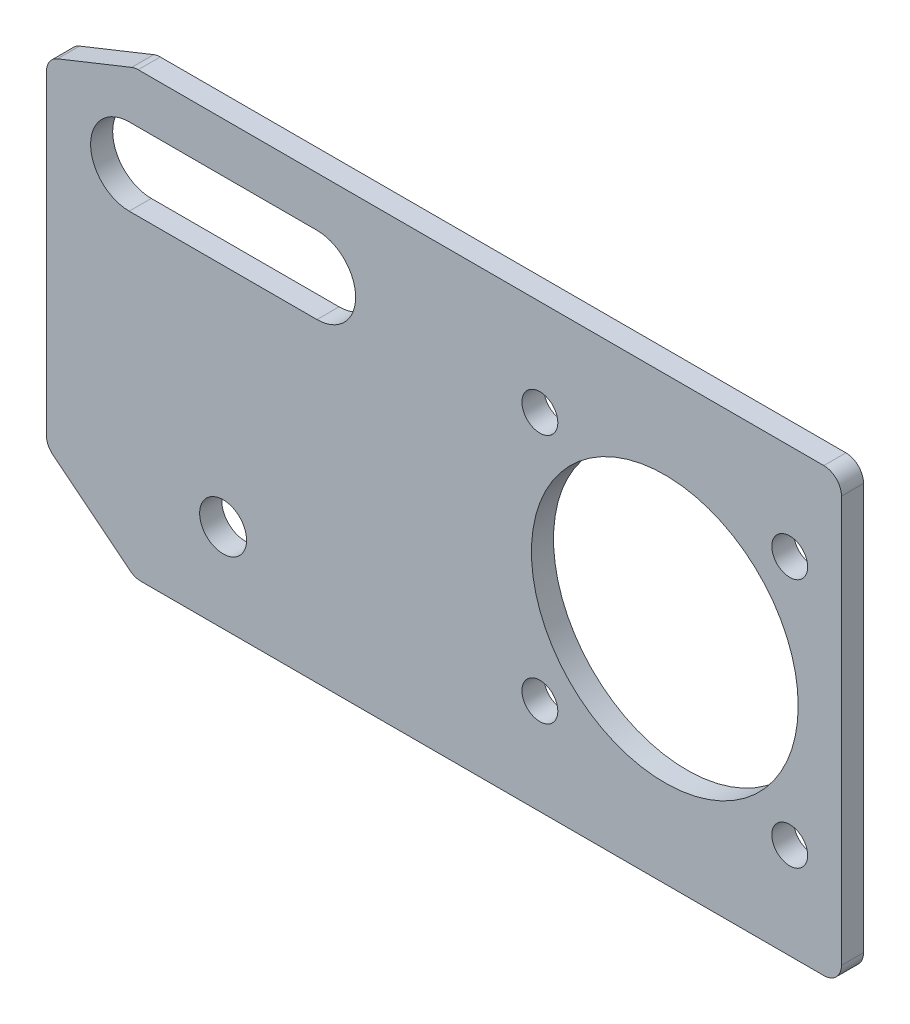
ISO-10303-21;
HEADER;
FILE_DESCRIPTION(('STEP AP214'),'2;1');
FILE_NAME('part.step','',(''),(''),'','','');
FILE_SCHEMA(('AUTOMOTIVE_DESIGN { 1 0 10303 214 1 1 1 1 }'));
ENDSEC;
DATA;
#1=APPLICATION_CONTEXT('core data for automotive mechanical design processes');
#2=APPLICATION_PROTOCOL_DEFINITION('international standard','automotive_design',2000,#1);
#3=PRODUCT_CONTEXT('',#1,'mechanical');
#4=PRODUCT('Part','Part','',(#3));
#5=PRODUCT_RELATED_PRODUCT_CATEGORY('part','',(#4));
#6=PRODUCT_DEFINITION_FORMATION('','',#4);
#7=PRODUCT_DEFINITION_CONTEXT('part definition',#1,'design');
#8=PRODUCT_DEFINITION('design','',#6,#7);
#9=PRODUCT_DEFINITION_SHAPE('','',#8);
#10=(LENGTH_UNIT() NAMED_UNIT(*) SI_UNIT(.MILLI.,.METRE.));
#11=(NAMED_UNIT(*) PLANE_ANGLE_UNIT() SI_UNIT($,.RADIAN.));
#12=(NAMED_UNIT(*) SI_UNIT($,.STERADIAN.) SOLID_ANGLE_UNIT());
#13=UNCERTAINTY_MEASURE_WITH_UNIT(LENGTH_MEASURE(1.E-05),#10,'distance_accuracy_value','');
#14=(GEOMETRIC_REPRESENTATION_CONTEXT(3) GLOBAL_UNCERTAINTY_ASSIGNED_CONTEXT((#13)) GLOBAL_UNIT_ASSIGNED_CONTEXT((#10,
#11,#12)) REPRESENTATION_CONTEXT('',''));
#15=CARTESIAN_POINT('',(0.,0.,0.));
#16=DIRECTION('',(0.,0.,1.));
#17=DIRECTION('',(1.,0.,0.));
#18=AXIS2_PLACEMENT_3D('',#15,#16,#17);
#19=CARTESIAN_POINT('',(-12.7,10.16,3.175));
#20=DIRECTION('',(0.624695047554424,0.78086880944303,0.));
#21=DIRECTION('',(-0.78086880944303,0.624695047554425,0.));
#22=AXIS2_PLACEMENT_3D('',#19,#20,#21);
#23=PLANE('',#22);
#24=DIRECTION('',(0.78086880944303,-0.624695047554425,0.));
#25=VECTOR('',#24,1.);
#26=CARTESIAN_POINT('',(-12.7,10.16,0.));
#27=LINE('',#26,#25);
#28=CARTESIAN_POINT('',(-11.7467254207882,9.39738033663059,0.));
#29=VERTEX_POINT('',#28);
#30=CARTESIAN_POINT('',(-0.695741530018378,0.556593224014704,0.));
#31=VERTEX_POINT('',#30);
#32=EDGE_CURVE('E204',#29,#31,#27,.T.);
#33=ORIENTED_EDGE('',*,*,#32,.T.);
#34=DIRECTION('',(0.,0.,-1.));
#35=VECTOR('',#34,1.);
#36=CARTESIAN_POINT('',(-0.695741530018378,0.556593224014704,3.175));
#37=LINE('',#36,#35);
#38=CARTESIAN_POINT('',(-0.695741530018378,0.556593224014704,3.175));
#39=VERTEX_POINT('',#38);
#40=EDGE_CURVE('E259',#31,#39,#37,.F.);
#41=ORIENTED_EDGE('',*,*,#40,.T.);
#42=DIRECTION('',(0.78086880944303,-0.624695047554425,0.));
#43=VECTOR('',#42,1.);
#44=CARTESIAN_POINT('',(-12.7,10.16,3.175));
#45=LINE('',#44,#43);
#46=CARTESIAN_POINT('',(-11.7467254207882,9.39738033663059,3.175));
#47=VERTEX_POINT('',#46);
#48=EDGE_CURVE('E207',#47,#39,#45,.T.);
#49=ORIENTED_EDGE('',*,*,#48,.F.);
#50=DIRECTION('',(0.,0.,-1.));
#51=VECTOR('',#50,1.);
#52=CARTESIAN_POINT('',(-11.7467254207882,9.39738033663059,3.175));
#53=LINE('',#52,#51);
#54=EDGE_CURVE('E256',#47,#29,#53,.T.);
#55=ORIENTED_EDGE('',*,*,#54,.T.);
#56=EDGE_LOOP('',(#33,#41,#49,#55));
#57=FACE_BOUND('',#56,.T.);
#58=ADVANCED_FACE('F33',(#57),#23,.F.);
#59=CARTESIAN_POINT('',(0.,0.,3.175));
#60=DIRECTION('',(0.,1.,0.));
#61=DIRECTION('',(0.,0.,1.));
#62=AXIS2_PLACEMENT_3D('',#59,#60,#61);
#63=PLANE('',#62);
#64=DIRECTION('',(1.,0.,0.));
#65=VECTOR('',#64,1.);
#66=CARTESIAN_POINT('',(0.,0.,3.175));
#67=LINE('',#66,#65);
#68=CARTESIAN_POINT('',(0.89098389076986,0.,3.175));
#69=VERTEX_POINT('',#68);
#70=CARTESIAN_POINT('',(99.06,0.,3.175));
#71=VERTEX_POINT('',#70);
#72=EDGE_CURVE('E210',#69,#71,#67,.T.);
#73=ORIENTED_EDGE('',*,*,#72,.F.);
#74=DIRECTION('',(0.,0.,-1.));
#75=VECTOR('',#74,1.);
#76=CARTESIAN_POINT('',(0.89098389076986,0.,3.175));
#77=LINE('',#76,#75);
#78=CARTESIAN_POINT('',(0.89098389076986,0.,0.));
#79=VERTEX_POINT('',#78);
#80=EDGE_CURVE('E241',#69,#79,#77,.T.);
#81=ORIENTED_EDGE('',*,*,#80,.T.);
#82=DIRECTION('',(1.,0.,0.));
#83=VECTOR('',#82,1.);
#84=CARTESIAN_POINT('',(0.,0.,0.));
#85=LINE('',#84,#83);
#86=CARTESIAN_POINT('',(99.06,0.,0.));
#87=VERTEX_POINT('',#86);
#88=EDGE_CURVE('E227',#79,#87,#85,.T.);
#89=ORIENTED_EDGE('',*,*,#88,.T.);
#90=DIRECTION('',(0.,0.,-1.));
#91=VECTOR('',#90,1.);
#92=CARTESIAN_POINT('',(99.06,0.,3.175));
#93=LINE('',#92,#91);
#94=EDGE_CURVE('E224',#87,#71,#93,.F.);
#95=ORIENTED_EDGE('',*,*,#94,.T.);
#96=EDGE_LOOP('',(#73,#81,#89,#95));
#97=FACE_BOUND('',#96,.T.);
#98=ADVANCED_FACE('F331',(#97),#63,.F.);
#99=CARTESIAN_POINT('',(101.6,0.,3.175));
#100=DIRECTION('',(-1.,0.,0.));
#101=DIRECTION('',(0.,0.,1.));
#102=AXIS2_PLACEMENT_3D('',#99,#100,#101);
#103=PLANE('',#102);
#104=DIRECTION('',(0.,1.,0.));
#105=VECTOR('',#104,1.);
#106=CARTESIAN_POINT('',(101.6,0.,3.175));
#107=LINE('',#106,#105);
#108=CARTESIAN_POINT('',(101.6,2.54,3.175));
#109=VERTEX_POINT('',#108);
#110=CARTESIAN_POINT('',(101.6,60.96,3.175));
#111=VERTEX_POINT('',#110);
#112=EDGE_CURVE('E214',#109,#111,#107,.T.);
#113=ORIENTED_EDGE('',*,*,#112,.F.);
#114=DIRECTION('',(0.,0.,-1.));
#115=VECTOR('',#114,1.);
#116=CARTESIAN_POINT('',(101.6,2.54,3.175));
#117=LINE('',#116,#115);
#118=CARTESIAN_POINT('',(101.6,2.54,0.));
#119=VERTEX_POINT('',#118);
#120=EDGE_CURVE('E11',#109,#119,#117,.T.);
#121=ORIENTED_EDGE('',*,*,#120,.T.);
#122=DIRECTION('',(0.,1.,0.));
#123=VECTOR('',#122,1.);
#124=CARTESIAN_POINT('',(101.6,0.,0.));
#125=LINE('',#124,#123);
#126=CARTESIAN_POINT('',(101.6,60.96,0.));
#127=VERTEX_POINT('',#126);
#128=EDGE_CURVE('E230',#119,#127,#125,.T.);
#129=ORIENTED_EDGE('',*,*,#128,.T.);
#130=DIRECTION('',(0.,0.,-1.));
#131=VECTOR('',#130,1.);
#132=CARTESIAN_POINT('',(101.6,60.96,3.175));
#133=LINE('',#132,#131);
#134=EDGE_CURVE('E41',#127,#111,#133,.F.);
#135=ORIENTED_EDGE('',*,*,#134,.T.);
#136=EDGE_LOOP('',(#113,#121,#129,#135));
#137=FACE_BOUND('',#136,.T.);
#138=ADVANCED_FACE('F288',(#137),#103,.F.);
#139=CARTESIAN_POINT('',(0.,63.5,3.175));
#140=DIRECTION('',(0.,-1.,0.));
#141=DIRECTION('',(0.,0.,-1.));
#142=AXIS2_PLACEMENT_3D('',#139,#140,#141);
#143=PLANE('',#142);
#144=DIRECTION('',(-1.,0.,0.));
#145=VECTOR('',#144,1.);
#146=CARTESIAN_POINT('',(0.,63.5,0.));
#147=LINE('',#146,#145);
#148=CARTESIAN_POINT('',(99.06,63.5,0.));
#149=VERTEX_POINT('',#148);
#150=CARTESIAN_POINT('',(0.489159305060825,63.5,0.));
#151=VERTEX_POINT('',#150);
#152=EDGE_CURVE('E233',#149,#151,#147,.T.);
#153=ORIENTED_EDGE('',*,*,#152,.T.);
#154=DIRECTION('',(0.,0.,-1.));
#155=VECTOR('',#154,1.);
#156=CARTESIAN_POINT('',(0.489159305060825,63.5,3.175));
#157=LINE('',#156,#155);
#158=CARTESIAN_POINT('',(0.489159305060825,63.5,3.175));
#159=VERTEX_POINT('',#158);
#160=EDGE_CURVE('E284',#151,#159,#157,.F.);
#161=ORIENTED_EDGE('',*,*,#160,.T.);
#162=DIRECTION('',(-1.,0.,0.));
#163=VECTOR('',#162,1.);
#164=CARTESIAN_POINT('',(0.,63.5,3.175));
#165=LINE('',#164,#163);
#166=CARTESIAN_POINT('',(99.06,63.5,3.175));
#167=VERTEX_POINT('',#166);
#168=EDGE_CURVE('E217',#167,#159,#165,.T.);
#169=ORIENTED_EDGE('',*,*,#168,.F.);
#170=DIRECTION('',(0.,0.,-1.));
#171=VECTOR('',#170,1.);
#172=CARTESIAN_POINT('',(99.06,63.5,3.175));
#173=LINE('',#172,#171);
#174=EDGE_CURVE('E281',#167,#149,#173,.T.);
#175=ORIENTED_EDGE('',*,*,#174,.T.);
#176=EDGE_LOOP('',(#153,#161,#169,#175));
#177=FACE_BOUND('',#176,.T.);
#178=ADVANCED_FACE('F299',(#177),#143,.F.);
#179=CARTESIAN_POINT('',(-12.7,58.42,3.175));
#180=DIRECTION('',(0.371390676354104,-0.928476690885259,0.));
#181=DIRECTION('',(0.928476690885259,0.371390676354104,0.));
#182=AXIS2_PLACEMENT_3D('',#179,#180,#181);
#183=PLANE('',#182);
#184=DIRECTION('',(-0.928476690885259,-0.371390676354104,0.));
#185=VECTOR('',#184,1.);
#186=CARTESIAN_POINT('',(-12.7,58.42,0.));
#187=LINE('',#186,#185);
#188=CARTESIAN_POINT('',(-0.454173012878601,63.3183307948486,0.));
#189=VERTEX_POINT('',#188);
#190=CARTESIAN_POINT('',(-11.1033323179394,59.0586670728242,0.));
#191=VERTEX_POINT('',#190);
#192=EDGE_CURVE('E236',#189,#191,#187,.T.);
#193=ORIENTED_EDGE('',*,*,#192,.T.);
#194=DIRECTION('',(0.,0.,-1.));
#195=VECTOR('',#194,1.);
#196=CARTESIAN_POINT('',(-11.1033323179394,59.0586670728242,3.175));
#197=LINE('',#196,#195);
#198=CARTESIAN_POINT('',(-11.1033323179394,59.0586670728242,3.175));
#199=VERTEX_POINT('',#198);
#200=EDGE_CURVE('E279',#191,#199,#197,.F.);
#201=ORIENTED_EDGE('',*,*,#200,.T.);
#202=DIRECTION('',(-0.928476690885259,-0.371390676354104,0.));
#203=VECTOR('',#202,1.);
#204=CARTESIAN_POINT('',(-12.7,58.42,3.175));
#205=LINE('',#204,#203);
#206=CARTESIAN_POINT('',(-0.454173012878601,63.3183307948486,3.175));
#207=VERTEX_POINT('',#206);
#208=EDGE_CURVE('E220',#207,#199,#205,.T.);
#209=ORIENTED_EDGE('',*,*,#208,.F.);
#210=DIRECTION('',(0.,0.,-1.));
#211=VECTOR('',#210,1.);
#212=CARTESIAN_POINT('',(-0.4541730128786,63.3183307948486,3.175));
#213=LINE('',#212,#211);
#214=EDGE_CURVE('E276',#207,#189,#213,.T.);
#215=ORIENTED_EDGE('',*,*,#214,.T.);
#216=EDGE_LOOP('',(#193,#201,#209,#215));
#217=FACE_BOUND('',#216,.T.);
#218=ADVANCED_FACE('F310',(#217),#183,.F.);
#219=CARTESIAN_POINT('',(-12.7,58.42,3.175));
#220=DIRECTION('',(1.,0.,0.));
#221=DIRECTION('',(0.,1.,0.));
#222=AXIS2_PLACEMENT_3D('',#219,#220,#221);
#223=PLANE('',#222);
#224=DIRECTION('',(0.,-1.,0.));
#225=VECTOR('',#224,1.);
#226=CARTESIAN_POINT('',(-12.7,58.42,0.));
#227=LINE('',#226,#225);
#228=CARTESIAN_POINT('',(-12.7,56.7003362779757,0.));
#229=VERTEX_POINT('',#228);
#230=CARTESIAN_POINT('',(-12.7,11.3807871126159,0.));
#231=VERTEX_POINT('',#230);
#232=EDGE_CURVE('E211',#229,#231,#227,.T.);
#233=ORIENTED_EDGE('',*,*,#232,.T.);
#234=DIRECTION('',(0.,0.,-1.));
#235=VECTOR('',#234,1.);
#236=CARTESIAN_POINT('',(-12.7,11.3807871126159,3.175));
#237=LINE('',#236,#235);
#238=CARTESIAN_POINT('',(-12.7,11.3807871126159,3.175));
#239=VERTEX_POINT('',#238);
#240=EDGE_CURVE('E48',#231,#239,#237,.F.);
#241=ORIENTED_EDGE('',*,*,#240,.T.);
#242=DIRECTION('',(0.,-1.,0.));
#243=VECTOR('',#242,1.);
#244=CARTESIAN_POINT('',(-12.7,58.42,3.175));
#245=LINE('',#244,#243);
#246=CARTESIAN_POINT('',(-12.7,56.7003362779757,3.175));
#247=VERTEX_POINT('',#246);
#248=EDGE_CURVE('E222',#247,#239,#245,.T.);
#249=ORIENTED_EDGE('',*,*,#248,.F.);
#250=DIRECTION('',(0.,0.,-1.));
#251=VECTOR('',#250,1.);
#252=CARTESIAN_POINT('',(-12.7,56.7003362779757,3.175));
#253=LINE('',#252,#251);
#254=EDGE_CURVE('E272',#247,#229,#253,.T.);
#255=ORIENTED_EDGE('',*,*,#254,.T.);
#256=EDGE_LOOP('',(#233,#241,#249,#255));
#257=FACE_BOUND('',#256,.T.);
#258=ADVANCED_FACE('F316',(#257),#223,.F.);
#259=CARTESIAN_POINT('',(0.,0.,3.175));
#260=DIRECTION('',(0.,0.,1.));
#261=DIRECTION('',(1.,0.,0.));
#262=AXIS2_PLACEMENT_3D('',#259,#260,#261);
#263=PLANE('',#262);
#264=CARTESIAN_POINT('',(58.239487757862,49.7105122421397,3.175));
#265=DIRECTION('',(0.,0.,1.));
#266=DIRECTION('',(1.,0.,0.));
#267=AXIS2_PLACEMENT_3D('',#264,#265,#266);
#268=CIRCLE('',#267,2.57975099999999);
#269=CARTESIAN_POINT('',(60.819238757862,49.7105122421397,3.175));
#270=VERTEX_POINT('',#269);
#271=EDGE_CURVE('E561',#270,#270,#268,.T.);
#272=ORIENTED_EDGE('',*,*,#271,.F.);
#273=EDGE_LOOP('',(#272));
#274=FACE_BOUND('',#273,.T.);
#275=CARTESIAN_POINT('',(94.1605122421404,49.7105122421388,3.175));
#276=DIRECTION('',(0.,0.,1.));
#277=DIRECTION('',(1.,0.,0.));
#278=AXIS2_PLACEMENT_3D('',#275,#276,#277);
#279=CIRCLE('',#278,2.57975099999999);
#280=CARTESIAN_POINT('',(96.7402632421404,49.7105122421388,3.175));
#281=VERTEX_POINT('',#280);
#282=EDGE_CURVE('E563',#281,#281,#279,.T.);
#283=ORIENTED_EDGE('',*,*,#282,.F.);
#284=EDGE_LOOP('',(#283));
#285=FACE_BOUND('',#284,.T.);
#286=CARTESIAN_POINT('',(94.1605122421399,13.7894877578608,3.175));
#287=DIRECTION('',(0.,0.,1.));
#288=DIRECTION('',(1.,0.,0.));
#289=AXIS2_PLACEMENT_3D('',#286,#287,#288);
#290=CIRCLE('',#289,2.57975099999999);
#291=CARTESIAN_POINT('',(96.7402632421399,13.7894877578608,3.175));
#292=VERTEX_POINT('',#291);
#293=EDGE_CURVE('E571',#292,#292,#290,.T.);
#294=ORIENTED_EDGE('',*,*,#293,.F.);
#295=EDGE_LOOP('',(#294));
#296=FACE_BOUND('',#295,.T.);
#297=CARTESIAN_POINT('',(58.2394877578613,13.7894877578617,3.175));
#298=DIRECTION('',(0.,0.,1.));
#299=DIRECTION('',(1.,0.,0.));
#300=AXIS2_PLACEMENT_3D('',#297,#298,#299);
#301=CIRCLE('',#300,2.57975099999999);
#302=CARTESIAN_POINT('',(60.8192387578612,13.7894877578617,3.175));
#303=VERTEX_POINT('',#302);
#304=EDGE_CURVE('E576',#303,#303,#301,.T.);
#305=ORIENTED_EDGE('',*,*,#304,.F.);
#306=EDGE_LOOP('',(#305));
#307=FACE_BOUND('',#306,.T.);
#308=CARTESIAN_POINT('',(-0.793749999999998,50.8,3.175));
#309=DIRECTION('',(0.,0.,1.));
#310=DIRECTION('',(1.,0.,0.));
#311=AXIS2_PLACEMENT_3D('',#308,#309,#310);
#312=CIRCLE('',#311,5.55624999999998);
#313=CARTESIAN_POINT('',(-0.793750000000003,56.35625,3.175));
#314=VERTEX_POINT('',#313);
#315=CARTESIAN_POINT('',(-0.793750000000003,45.24375,3.175));
#316=VERTEX_POINT('',#315);
#317=EDGE_CURVE('E155',#314,#316,#312,.T.);
#318=ORIENTED_EDGE('',*,*,#317,.F.);
#319=DIRECTION('',(-1.,0.,0.));
#320=VECTOR('',#319,1.);
#321=CARTESIAN_POINT('',(-0.793750000000003,56.35625,3.175));
#322=LINE('',#321,#320);
#323=CARTESIAN_POINT('',(26.19375,56.35625,3.175));
#324=VERTEX_POINT('',#323);
#325=EDGE_CURVE('E173',#324,#314,#322,.T.);
#326=ORIENTED_EDGE('',*,*,#325,.F.);
#327=CARTESIAN_POINT('',(26.19375,50.8,3.175));
#328=DIRECTION('',(0.,0.,1.));
#329=DIRECTION('',(1.,0.,0.));
#330=AXIS2_PLACEMENT_3D('',#327,#328,#329);
#331=CIRCLE('',#330,5.55624999999998);
#332=CARTESIAN_POINT('',(26.19375,45.24375,3.175));
#333=VERTEX_POINT('',#332);
#334=EDGE_CURVE('E176',#333,#324,#331,.T.);
#335=ORIENTED_EDGE('',*,*,#334,.F.);
#336=DIRECTION('',(1.,0.,0.));
#337=VECTOR('',#336,1.);
#338=CARTESIAN_POINT('',(-0.793750000000003,45.24375,3.175));
#339=LINE('',#338,#337);
#340=EDGE_CURVE('E185',#316,#333,#339,.T.);
#341=ORIENTED_EDGE('',*,*,#340,.F.);
#342=EDGE_LOOP('',(#318,#326,#335,#341));
#343=FACE_BOUND('',#342,.T.);
#344=CARTESIAN_POINT('',(12.7,12.7,3.175));
#345=DIRECTION('',(0.,0.,1.));
#346=DIRECTION('',(1.,0.,0.));
#347=AXIS2_PLACEMENT_3D('',#344,#345,#346);
#348=CIRCLE('',#347,3.3734375);
#349=CARTESIAN_POINT('',(16.0734375,12.7,3.175));
#350=VERTEX_POINT('',#349);
#351=EDGE_CURVE('E191',#350,#350,#348,.T.);
#352=ORIENTED_EDGE('',*,*,#351,.F.);
#353=EDGE_LOOP('',(#352));
#354=FACE_BOUND('',#353,.T.);
#355=CARTESIAN_POINT('',(76.2,31.75,3.175));
#356=DIRECTION('',(0.,0.,1.));
#357=DIRECTION('',(1.,0.,0.));
#358=AXIS2_PLACEMENT_3D('',#355,#356,#357);
#359=CIRCLE('',#358,19.177);
#360=CARTESIAN_POINT('',(95.377,31.75,3.175));
#361=VERTEX_POINT('',#360);
#362=EDGE_CURVE('E198',#361,#361,#359,.T.);
#363=ORIENTED_EDGE('',*,*,#362,.F.);
#364=EDGE_LOOP('',(#363));
#365=FACE_BOUND('',#364,.T.);
#366=ORIENTED_EDGE('',*,*,#48,.T.);
#367=CARTESIAN_POINT('',(0.89098389076986,2.54,3.175));
#368=DIRECTION('',(0.,0.,1.));
#369=DIRECTION('',(1.,0.,0.));
#370=AXIS2_PLACEMENT_3D('',#367,#368,#369);
#371=CIRCLE('',#370,2.54);
#372=EDGE_CURVE('E270',#39,#69,#371,.T.);
#373=ORIENTED_EDGE('',*,*,#372,.T.);
#374=ORIENTED_EDGE('',*,*,#72,.T.);
#375=CARTESIAN_POINT('',(99.06,2.54,3.175));
#376=DIRECTION('',(0.,0.,1.));
#377=DIRECTION('',(1.,0.,0.));
#378=AXIS2_PLACEMENT_3D('',#375,#376,#377);
#379=CIRCLE('',#378,2.54);
#380=EDGE_CURVE('E263',#71,#109,#379,.T.);
#381=ORIENTED_EDGE('',*,*,#380,.T.);
#382=ORIENTED_EDGE('',*,*,#112,.T.);
#383=CARTESIAN_POINT('',(99.06,60.96,3.175));
#384=DIRECTION('',(0.,0.,1.));
#385=DIRECTION('',(1.,0.,0.));
#386=AXIS2_PLACEMENT_3D('',#383,#384,#385);
#387=CIRCLE('',#386,2.54);
#388=EDGE_CURVE('E261',#111,#167,#387,.T.);
#389=ORIENTED_EDGE('',*,*,#388,.T.);
#390=ORIENTED_EDGE('',*,*,#168,.T.);
#391=CARTESIAN_POINT('',(0.489159305060825,60.96,3.175));
#392=DIRECTION('',(0.,0.,1.));
#393=DIRECTION('',(1.,0.,0.));
#394=AXIS2_PLACEMENT_3D('',#391,#392,#393);
#395=CIRCLE('',#394,2.54);
#396=EDGE_CURVE('E265',#159,#207,#395,.T.);
#397=ORIENTED_EDGE('',*,*,#396,.T.);
#398=ORIENTED_EDGE('',*,*,#208,.T.);
#399=CARTESIAN_POINT('',(-10.16,56.7003362779757,3.175));
#400=DIRECTION('',(0.,0.,1.));
#401=DIRECTION('',(1.,0.,0.));
#402=AXIS2_PLACEMENT_3D('',#399,#400,#401);
#403=CIRCLE('',#402,2.54);
#404=EDGE_CURVE('E55',#199,#247,#403,.T.);
#405=ORIENTED_EDGE('',*,*,#404,.T.);
#406=ORIENTED_EDGE('',*,*,#248,.T.);
#407=CARTESIAN_POINT('',(-10.16,11.3807871126159,3.175));
#408=DIRECTION('',(0.,0.,1.));
#409=DIRECTION('',(1.,0.,0.));
#410=AXIS2_PLACEMENT_3D('',#407,#408,#409);
#411=CIRCLE('',#410,2.54);
#412=EDGE_CURVE('E268',#239,#47,#411,.T.);
#413=ORIENTED_EDGE('',*,*,#412,.T.);
#414=EDGE_LOOP('',(#366,#373,#374,#381,#382,#389,#390,#397,#398,#405,#406,#413));
#415=FACE_BOUND('',#414,.T.);
#416=ADVANCED_FACE('F293',(#274,#285,#296,#307,#343,#354,#365,#415),#263,.T.);
#417=CARTESIAN_POINT('',(0.,0.,0.));
#418=DIRECTION('',(0.,0.,1.));
#419=DIRECTION('',(1.,0.,0.));
#420=AXIS2_PLACEMENT_3D('',#417,#418,#419);
#421=PLANE('',#420);
#422=CARTESIAN_POINT('',(58.239487757862,49.7105122421397,0.));
#423=DIRECTION('',(0.,0.,1.));
#424=DIRECTION('',(1.,0.,0.));
#425=AXIS2_PLACEMENT_3D('',#422,#423,#424);
#426=CIRCLE('',#425,2.579751);
#427=CARTESIAN_POINT('',(60.819238757862,49.7105122421397,0.));
#428=VERTEX_POINT('',#427);
#429=EDGE_CURVE('E558',#428,#428,#426,.T.);
#430=ORIENTED_EDGE('',*,*,#429,.T.);
#431=EDGE_LOOP('',(#430));
#432=FACE_BOUND('',#431,.T.);
#433=CARTESIAN_POINT('',(94.1605122421404,49.7105122421388,0.));
#434=DIRECTION('',(0.,0.,1.));
#435=DIRECTION('',(1.,0.,0.));
#436=AXIS2_PLACEMENT_3D('',#433,#434,#435);
#437=CIRCLE('',#436,2.57975099999999);
#438=CARTESIAN_POINT('',(96.7402632421404,49.7105122421388,0.));
#439=VERTEX_POINT('',#438);
#440=EDGE_CURVE('E568',#439,#439,#437,.T.);
#441=ORIENTED_EDGE('',*,*,#440,.T.);
#442=EDGE_LOOP('',(#441));
#443=FACE_BOUND('',#442,.T.);
#444=CARTESIAN_POINT('',(94.1605122421399,13.7894877578608,0.));
#445=DIRECTION('',(0.,0.,1.));
#446=DIRECTION('',(1.,0.,0.));
#447=AXIS2_PLACEMENT_3D('',#444,#445,#446);
#448=CIRCLE('',#447,2.57975099999999);
#449=CARTESIAN_POINT('',(96.7402632421399,13.7894877578608,0.));
#450=VERTEX_POINT('',#449);
#451=EDGE_CURVE('E574',#450,#450,#448,.T.);
#452=ORIENTED_EDGE('',*,*,#451,.T.);
#453=EDGE_LOOP('',(#452));
#454=FACE_BOUND('',#453,.T.);
#455=CARTESIAN_POINT('',(58.2394877578613,13.7894877578617,0.));
#456=DIRECTION('',(0.,0.,1.));
#457=DIRECTION('',(1.,0.,0.));
#458=AXIS2_PLACEMENT_3D('',#455,#456,#457);
#459=CIRCLE('',#458,2.579751);
#460=CARTESIAN_POINT('',(60.8192387578612,13.7894877578617,0.));
#461=VERTEX_POINT('',#460);
#462=EDGE_CURVE('E179',#461,#461,#459,.T.);
#463=ORIENTED_EDGE('',*,*,#462,.T.);
#464=EDGE_LOOP('',(#463));
#465=FACE_BOUND('',#464,.T.);
#466=DIRECTION('',(-1.,0.,0.));
#467=VECTOR('',#466,1.);
#468=CARTESIAN_POINT('',(-0.793750000000003,56.35625,0.));
#469=LINE('',#468,#467);
#470=CARTESIAN_POINT('',(26.19375,56.35625,0.));
#471=VERTEX_POINT('',#470);
#472=CARTESIAN_POINT('',(-0.793750000000003,56.35625,0.));
#473=VERTEX_POINT('',#472);
#474=EDGE_CURVE('E160',#471,#473,#469,.T.);
#475=ORIENTED_EDGE('',*,*,#474,.T.);
#476=CARTESIAN_POINT('',(-0.793749999999998,50.8,0.));
#477=DIRECTION('',(0.,0.,1.));
#478=DIRECTION('',(1.,0.,0.));
#479=AXIS2_PLACEMENT_3D('',#476,#477,#478);
#480=CIRCLE('',#479,5.55624999999998);
#481=CARTESIAN_POINT('',(-0.793750000000003,45.24375,0.));
#482=VERTEX_POINT('',#481);
#483=EDGE_CURVE('E152',#473,#482,#480,.T.);
#484=ORIENTED_EDGE('',*,*,#483,.T.);
#485=DIRECTION('',(1.,0.,0.));
#486=VECTOR('',#485,1.);
#487=CARTESIAN_POINT('',(-0.793750000000003,45.24375,0.));
#488=LINE('',#487,#486);
#489=CARTESIAN_POINT('',(26.19375,45.24375,0.));
#490=VERTEX_POINT('',#489);
#491=EDGE_CURVE('E164',#482,#490,#488,.T.);
#492=ORIENTED_EDGE('',*,*,#491,.T.);
#493=CARTESIAN_POINT('',(26.19375,50.8,0.));
#494=DIRECTION('',(0.,0.,1.));
#495=DIRECTION('',(1.,0.,0.));
#496=AXIS2_PLACEMENT_3D('',#493,#494,#495);
#497=CIRCLE('',#496,5.55624999999998);
#498=EDGE_CURVE('E168',#490,#471,#497,.T.);
#499=ORIENTED_EDGE('',*,*,#498,.T.);
#500=EDGE_LOOP('',(#475,#484,#492,#499));
#501=FACE_BOUND('',#500,.T.);
#502=CARTESIAN_POINT('',(12.7,12.7,0.));
#503=DIRECTION('',(0.,0.,1.));
#504=DIRECTION('',(1.,0.,0.));
#505=AXIS2_PLACEMENT_3D('',#502,#503,#504);
#506=CIRCLE('',#505,3.3734375);
#507=CARTESIAN_POINT('',(16.0734375,12.7,0.));
#508=VERTEX_POINT('',#507);
#509=EDGE_CURVE('E195',#508,#508,#506,.T.);
#510=ORIENTED_EDGE('',*,*,#509,.T.);
#511=EDGE_LOOP('',(#510));
#512=FACE_BOUND('',#511,.T.);
#513=CARTESIAN_POINT('',(76.2,31.75,0.));
#514=DIRECTION('',(0.,0.,1.));
#515=DIRECTION('',(1.,0.,0.));
#516=AXIS2_PLACEMENT_3D('',#513,#514,#515);
#517=CIRCLE('',#516,19.177);
#518=CARTESIAN_POINT('',(95.377,31.75,0.));
#519=VERTEX_POINT('',#518);
#520=EDGE_CURVE('E201',#519,#519,#517,.T.);
#521=ORIENTED_EDGE('',*,*,#520,.T.);
#522=EDGE_LOOP('',(#521));
#523=FACE_BOUND('',#522,.T.);
#524=ORIENTED_EDGE('',*,*,#88,.F.);
#525=CARTESIAN_POINT('',(0.89098389076986,2.54,0.));
#526=DIRECTION('',(0.,0.,1.));
#527=DIRECTION('',(1.,0.,0.));
#528=AXIS2_PLACEMENT_3D('',#525,#526,#527);
#529=CIRCLE('',#528,2.54);
#530=EDGE_CURVE('E254',#79,#31,#529,.F.);
#531=ORIENTED_EDGE('',*,*,#530,.T.);
#532=ORIENTED_EDGE('',*,*,#32,.F.);
#533=CARTESIAN_POINT('',(-10.16,11.3807871126159,0.));
#534=DIRECTION('',(0.,0.,1.));
#535=DIRECTION('',(1.,0.,0.));
#536=AXIS2_PLACEMENT_3D('',#533,#534,#535);
#537=CIRCLE('',#536,2.54);
#538=EDGE_CURVE('E252',#29,#231,#537,.F.);
#539=ORIENTED_EDGE('',*,*,#538,.T.);
#540=ORIENTED_EDGE('',*,*,#232,.F.);
#541=CARTESIAN_POINT('',(-10.16,56.7003362779757,0.));
#542=DIRECTION('',(0.,0.,1.));
#543=DIRECTION('',(1.,0.,0.));
#544=AXIS2_PLACEMENT_3D('',#541,#542,#543);
#545=CIRCLE('',#544,2.54);
#546=EDGE_CURVE('E250',#229,#191,#545,.F.);
#547=ORIENTED_EDGE('',*,*,#546,.T.);
#548=ORIENTED_EDGE('',*,*,#192,.F.);
#549=CARTESIAN_POINT('',(0.489159305060825,60.96,0.));
#550=DIRECTION('',(0.,0.,1.));
#551=DIRECTION('',(1.,0.,0.));
#552=AXIS2_PLACEMENT_3D('',#549,#550,#551);
#553=CIRCLE('',#552,2.54);
#554=EDGE_CURVE('E248',#189,#151,#553,.F.);
#555=ORIENTED_EDGE('',*,*,#554,.T.);
#556=ORIENTED_EDGE('',*,*,#152,.F.);
#557=CARTESIAN_POINT('',(99.06,60.96,0.));
#558=DIRECTION('',(0.,0.,1.));
#559=DIRECTION('',(1.,0.,0.));
#560=AXIS2_PLACEMENT_3D('',#557,#558,#559);
#561=CIRCLE('',#560,2.54);
#562=EDGE_CURVE('E244',#149,#127,#561,.F.);
#563=ORIENTED_EDGE('',*,*,#562,.T.);
#564=ORIENTED_EDGE('',*,*,#128,.F.);
#565=CARTESIAN_POINT('',(99.06,2.54,0.));
#566=DIRECTION('',(0.,0.,1.));
#567=DIRECTION('',(1.,0.,0.));
#568=AXIS2_PLACEMENT_3D('',#565,#566,#567);
#569=CIRCLE('',#568,2.54);
#570=EDGE_CURVE('E246',#119,#87,#569,.F.);
#571=ORIENTED_EDGE('',*,*,#570,.T.);
#572=EDGE_LOOP('',(#524,#531,#532,#539,#540,#547,#548,#555,#556,#563,#564,#571));
#573=FACE_BOUND('',#572,.T.);
#574=ADVANCED_FACE('F170',(#432,#443,#454,#465,#501,#512,#523,#573),#421,.F.);
#575=CARTESIAN_POINT('',(76.2,31.75,0.));
#576=DIRECTION('',(0.,0.,1.));
#577=DIRECTION('',(1.,0.,0.));
#578=AXIS2_PLACEMENT_3D('',#575,#576,#577);
#579=CYLINDRICAL_SURFACE('',#578,19.177);
#580=ORIENTED_EDGE('',*,*,#520,.F.);
#581=EDGE_LOOP('',(#580));
#582=FACE_BOUND('',#581,.T.);
#583=ORIENTED_EDGE('',*,*,#362,.T.);
#584=EDGE_LOOP('',(#583));
#585=FACE_BOUND('',#584,.T.);
#586=ADVANCED_FACE('F395',(#582,#585),#579,.F.);
#587=CARTESIAN_POINT('',(12.7,12.7,0.));
#588=DIRECTION('',(0.,0.,1.));
#589=DIRECTION('',(1.,0.,0.));
#590=AXIS2_PLACEMENT_3D('',#587,#588,#589);
#591=CYLINDRICAL_SURFACE('',#590,3.3734375);
#592=ORIENTED_EDGE('',*,*,#509,.F.);
#593=EDGE_LOOP('',(#592));
#594=FACE_BOUND('',#593,.T.);
#595=ORIENTED_EDGE('',*,*,#351,.T.);
#596=EDGE_LOOP('',(#595));
#597=FACE_BOUND('',#596,.T.);
#598=ADVANCED_FACE('F454',(#594,#597),#591,.F.);
#599=CARTESIAN_POINT('',(-0.793749999999998,50.8,0.));
#600=DIRECTION('',(0.,0.,1.));
#601=DIRECTION('',(1.,0.,0.));
#602=AXIS2_PLACEMENT_3D('',#599,#600,#601);
#603=CYLINDRICAL_SURFACE('',#602,5.55624999999998);
#604=ORIENTED_EDGE('',*,*,#317,.T.);
#605=DIRECTION('',(0.,0.,1.));
#606=VECTOR('',#605,1.);
#607=CARTESIAN_POINT('',(-0.793750000000003,45.24375,0.));
#608=LINE('',#607,#606);
#609=EDGE_CURVE('E148',#482,#316,#608,.T.);
#610=ORIENTED_EDGE('',*,*,#609,.F.);
#611=ORIENTED_EDGE('',*,*,#483,.F.);
#612=DIRECTION('',(0.,0.,1.));
#613=VECTOR('',#612,1.);
#614=CARTESIAN_POINT('',(-0.793750000000003,56.35625,0.));
#615=LINE('',#614,#613);
#616=EDGE_CURVE('E189',#473,#314,#615,.T.);
#617=ORIENTED_EDGE('',*,*,#616,.T.);
#618=EDGE_LOOP('',(#604,#610,#611,#617));
#619=FACE_BOUND('',#618,.T.);
#620=ADVANCED_FACE('F150',(#619),#603,.F.);
#621=CARTESIAN_POINT('',(-0.793750000000003,56.35625,0.));
#622=DIRECTION('',(0.,1.,0.));
#623=DIRECTION('',(-1.,0.,0.));
#624=AXIS2_PLACEMENT_3D('',#621,#622,#623);
#625=PLANE('',#624);
#626=ORIENTED_EDGE('',*,*,#325,.T.);
#627=ORIENTED_EDGE('',*,*,#616,.F.);
#628=ORIENTED_EDGE('',*,*,#474,.F.);
#629=DIRECTION('',(0.,0.,1.));
#630=VECTOR('',#629,1.);
#631=CARTESIAN_POINT('',(26.19375,56.35625,0.));
#632=LINE('',#631,#630);
#633=EDGE_CURVE('E192',#471,#324,#632,.T.);
#634=ORIENTED_EDGE('',*,*,#633,.T.);
#635=EDGE_LOOP('',(#626,#627,#628,#634));
#636=FACE_BOUND('',#635,.T.);
#637=ADVANCED_FACE('F442',(#636),#625,.F.);
#638=CARTESIAN_POINT('',(26.19375,50.8,0.));
#639=DIRECTION('',(0.,0.,1.));
#640=DIRECTION('',(1.,0.,0.));
#641=AXIS2_PLACEMENT_3D('',#638,#639,#640);
#642=CYLINDRICAL_SURFACE('',#641,5.55624999999998);
#643=ORIENTED_EDGE('',*,*,#334,.T.);
#644=ORIENTED_EDGE('',*,*,#633,.F.);
#645=ORIENTED_EDGE('',*,*,#498,.F.);
#646=DIRECTION('',(0.,0.,1.));
#647=VECTOR('',#646,1.);
#648=CARTESIAN_POINT('',(26.19375,45.24375,0.));
#649=LINE('',#648,#647);
#650=EDGE_CURVE('E159',#490,#333,#649,.T.);
#651=ORIENTED_EDGE('',*,*,#650,.T.);
#652=EDGE_LOOP('',(#643,#644,#645,#651));
#653=FACE_BOUND('',#652,.T.);
#654=ADVANCED_FACE('F445',(#653),#642,.F.);
#655=CARTESIAN_POINT('',(-0.793750000000003,45.24375,0.));
#656=DIRECTION('',(0.,-1.,0.));
#657=DIRECTION('',(1.,0.,0.));
#658=AXIS2_PLACEMENT_3D('',#655,#656,#657);
#659=PLANE('',#658);
#660=ORIENTED_EDGE('',*,*,#340,.T.);
#661=ORIENTED_EDGE('',*,*,#650,.F.);
#662=ORIENTED_EDGE('',*,*,#491,.F.);
#663=ORIENTED_EDGE('',*,*,#609,.T.);
#664=EDGE_LOOP('',(#660,#661,#662,#663));
#665=FACE_BOUND('',#664,.T.);
#666=ADVANCED_FACE('F165',(#665),#659,.F.);
#667=CARTESIAN_POINT('',(0.89098389076986,2.54,3.175));
#668=DIRECTION('',(0.,0.,-1.));
#669=DIRECTION('',(-1.,0.,0.));
#670=AXIS2_PLACEMENT_3D('',#667,#668,#669);
#671=CYLINDRICAL_SURFACE('',#670,2.54);
#672=ORIENTED_EDGE('',*,*,#372,.F.);
#673=ORIENTED_EDGE('',*,*,#40,.F.);
#674=ORIENTED_EDGE('',*,*,#530,.F.);
#675=ORIENTED_EDGE('',*,*,#80,.F.);
#676=EDGE_LOOP('',(#672,#673,#674,#675));
#677=FACE_BOUND('',#676,.T.);
#678=ADVANCED_FACE('F329',(#677),#671,.T.);
#679=CARTESIAN_POINT('',(-10.16,11.3807871126159,3.175));
#680=DIRECTION('',(0.,0.,-1.));
#681=DIRECTION('',(-1.,0.,0.));
#682=AXIS2_PLACEMENT_3D('',#679,#680,#681);
#683=CYLINDRICAL_SURFACE('',#682,2.54);
#684=ORIENTED_EDGE('',*,*,#412,.F.);
#685=ORIENTED_EDGE('',*,*,#240,.F.);
#686=ORIENTED_EDGE('',*,*,#538,.F.);
#687=ORIENTED_EDGE('',*,*,#54,.F.);
#688=EDGE_LOOP('',(#684,#685,#686,#687));
#689=FACE_BOUND('',#688,.T.);
#690=ADVANCED_FACE('F321',(#689),#683,.T.);
#691=CARTESIAN_POINT('',(-10.16,56.7003362779757,3.175));
#692=DIRECTION('',(0.,0.,-1.));
#693=DIRECTION('',(-1.,0.,0.));
#694=AXIS2_PLACEMENT_3D('',#691,#692,#693);
#695=CYLINDRICAL_SURFACE('',#694,2.54);
#696=ORIENTED_EDGE('',*,*,#404,.F.);
#697=ORIENTED_EDGE('',*,*,#200,.F.);
#698=ORIENTED_EDGE('',*,*,#546,.F.);
#699=ORIENTED_EDGE('',*,*,#254,.F.);
#700=EDGE_LOOP('',(#696,#697,#698,#699));
#701=FACE_BOUND('',#700,.T.);
#702=ADVANCED_FACE('F314',(#701),#695,.T.);
#703=CARTESIAN_POINT('',(0.489159305060825,60.96,3.175));
#704=DIRECTION('',(0.,0.,-1.));
#705=DIRECTION('',(-1.,0.,0.));
#706=AXIS2_PLACEMENT_3D('',#703,#704,#705);
#707=CYLINDRICAL_SURFACE('',#706,2.54);
#708=ORIENTED_EDGE('',*,*,#396,.F.);
#709=ORIENTED_EDGE('',*,*,#160,.F.);
#710=ORIENTED_EDGE('',*,*,#554,.F.);
#711=ORIENTED_EDGE('',*,*,#214,.F.);
#712=EDGE_LOOP('',(#708,#709,#710,#711));
#713=FACE_BOUND('',#712,.T.);
#714=ADVANCED_FACE('F307',(#713),#707,.T.);
#715=CARTESIAN_POINT('',(99.06,2.54,3.175));
#716=DIRECTION('',(0.,0.,-1.));
#717=DIRECTION('',(-1.,0.,0.));
#718=AXIS2_PLACEMENT_3D('',#715,#716,#717);
#719=CYLINDRICAL_SURFACE('',#718,2.54);
#720=ORIENTED_EDGE('',*,*,#380,.F.);
#721=ORIENTED_EDGE('',*,*,#94,.F.);
#722=ORIENTED_EDGE('',*,*,#570,.F.);
#723=ORIENTED_EDGE('',*,*,#120,.F.);
#724=EDGE_LOOP('',(#720,#721,#722,#723));
#725=FACE_BOUND('',#724,.T.);
#726=ADVANCED_FACE('F334',(#725),#719,.T.);
#727=CARTESIAN_POINT('',(99.06,60.96,3.175));
#728=DIRECTION('',(0.,0.,-1.));
#729=DIRECTION('',(-1.,0.,0.));
#730=AXIS2_PLACEMENT_3D('',#727,#728,#729);
#731=CYLINDRICAL_SURFACE('',#730,2.54);
#732=ORIENTED_EDGE('',*,*,#388,.F.);
#733=ORIENTED_EDGE('',*,*,#134,.F.);
#734=ORIENTED_EDGE('',*,*,#562,.F.);
#735=ORIENTED_EDGE('',*,*,#174,.F.);
#736=EDGE_LOOP('',(#732,#733,#734,#735));
#737=FACE_BOUND('',#736,.T.);
#738=ADVANCED_FACE('F35',(#737),#731,.T.);
#739=CARTESIAN_POINT('',(58.2394877578613,13.7894877578617,3.175));
#740=DIRECTION('',(0.,0.,1.));
#741=DIRECTION('',(1.,0.,0.));
#742=AXIS2_PLACEMENT_3D('',#739,#740,#741);
#743=CYLINDRICAL_SURFACE('',#742,2.57975099999999);
#744=ORIENTED_EDGE('',*,*,#462,.F.);
#745=EDGE_LOOP('',(#744));
#746=FACE_BOUND('',#745,.T.);
#747=ORIENTED_EDGE('',*,*,#304,.T.);
#748=EDGE_LOOP('',(#747));
#749=FACE_BOUND('',#748,.T.);
#750=ADVANCED_FACE('F340',(#746,#749),#743,.F.);
#751=CARTESIAN_POINT('',(94.1605122421399,13.7894877578608,3.175));
#752=DIRECTION('',(0.,0.,1.));
#753=DIRECTION('',(1.,0.,0.));
#754=AXIS2_PLACEMENT_3D('',#751,#752,#753);
#755=CYLINDRICAL_SURFACE('',#754,2.57975099999999);
#756=ORIENTED_EDGE('',*,*,#451,.F.);
#757=EDGE_LOOP('',(#756));
#758=FACE_BOUND('',#757,.T.);
#759=ORIENTED_EDGE('',*,*,#293,.T.);
#760=EDGE_LOOP('',(#759));
#761=FACE_BOUND('',#760,.T.);
#762=ADVANCED_FACE('F405',(#758,#761),#755,.F.);
#763=CARTESIAN_POINT('',(94.1605122421404,49.7105122421388,3.175));
#764=DIRECTION('',(0.,0.,1.));
#765=DIRECTION('',(1.,0.,0.));
#766=AXIS2_PLACEMENT_3D('',#763,#764,#765);
#767=CYLINDRICAL_SURFACE('',#766,2.57975099999999);
#768=ORIENTED_EDGE('',*,*,#440,.F.);
#769=EDGE_LOOP('',(#768));
#770=FACE_BOUND('',#769,.T.);
#771=ORIENTED_EDGE('',*,*,#282,.T.);
#772=EDGE_LOOP('',(#771));
#773=FACE_BOUND('',#772,.T.);
#774=ADVANCED_FACE('F415',(#770,#773),#767,.F.);
#775=CARTESIAN_POINT('',(58.239487757862,49.7105122421397,3.175));
#776=DIRECTION('',(0.,0.,1.));
#777=DIRECTION('',(1.,0.,0.));
#778=AXIS2_PLACEMENT_3D('',#775,#776,#777);
#779=CYLINDRICAL_SURFACE('',#778,2.57975099999999);
#780=ORIENTED_EDGE('',*,*,#429,.F.);
#781=EDGE_LOOP('',(#780));
#782=FACE_BOUND('',#781,.T.);
#783=ORIENTED_EDGE('',*,*,#271,.T.);
#784=EDGE_LOOP('',(#783));
#785=FACE_BOUND('',#784,.T.);
#786=ADVANCED_FACE('F425',(#782,#785),#779,.F.);
#787=CLOSED_SHELL('',(#58,#98,#138,#178,#218,#258,#416,#574,#586,#598,#620,#637,#654,#666,#678,
#690,#702,#714,#726,#738,#750,#762,#774,#786));
#788=MANIFOLD_SOLID_BREP('B2',#787);
#789=ADVANCED_BREP_SHAPE_REPRESENTATION('',(#18,#788),#14);
#790=SHAPE_DEFINITION_REPRESENTATION(#9,#789);
ENDSEC;
END-ISO-10303-21;
